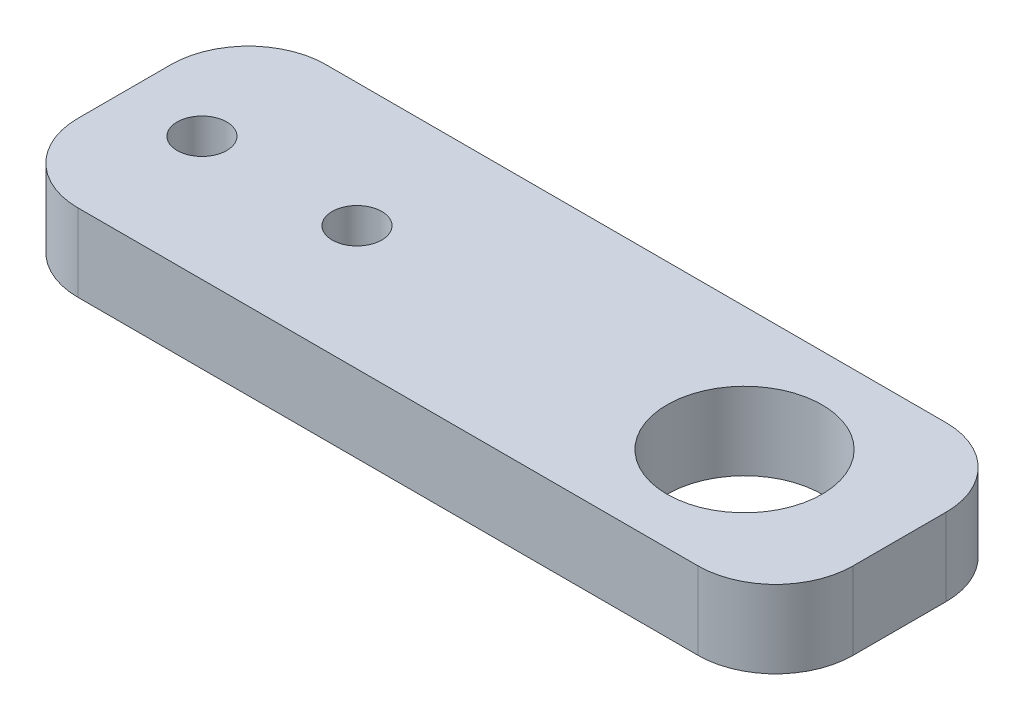
ISO-10303-21;
HEADER;
FILE_DESCRIPTION(('STEP AP214'),'2;1');
FILE_NAME('part.step','',(''),(''),'','','');
FILE_SCHEMA(('AUTOMOTIVE_DESIGN { 1 0 10303 214 1 1 1 1 }'));
ENDSEC;
DATA;
#1=APPLICATION_CONTEXT('core data for automotive mechanical design processes');
#2=APPLICATION_PROTOCOL_DEFINITION('international standard','automotive_design',2000,#1);
#3=PRODUCT_CONTEXT('',#1,'mechanical');
#4=PRODUCT('Part','Part','',(#3));
#5=PRODUCT_RELATED_PRODUCT_CATEGORY('part','',(#4));
#6=PRODUCT_DEFINITION_FORMATION('','',#4);
#7=PRODUCT_DEFINITION_CONTEXT('part definition',#1,'design');
#8=PRODUCT_DEFINITION('design','',#6,#7);
#9=PRODUCT_DEFINITION_SHAPE('','',#8);
#10=(LENGTH_UNIT() NAMED_UNIT(*) SI_UNIT(.MILLI.,.METRE.));
#11=(NAMED_UNIT(*) PLANE_ANGLE_UNIT() SI_UNIT($,.RADIAN.));
#12=(NAMED_UNIT(*) SI_UNIT($,.STERADIAN.) SOLID_ANGLE_UNIT());
#13=UNCERTAINTY_MEASURE_WITH_UNIT(LENGTH_MEASURE(1.E-05),#10,'distance_accuracy_value','');
#14=(GEOMETRIC_REPRESENTATION_CONTEXT(3) GLOBAL_UNCERTAINTY_ASSIGNED_CONTEXT((#13)) GLOBAL_UNIT_ASSIGNED_CONTEXT((#10,
#11,#12)) REPRESENTATION_CONTEXT('',''));
#15=CARTESIAN_POINT('',(0.,0.,0.));
#16=DIRECTION('',(0.,0.,1.));
#17=DIRECTION('',(1.,0.,0.));
#18=AXIS2_PLACEMENT_3D('',#15,#16,#17);
#19=CARTESIAN_POINT('',(0.,5.,0.));
#20=DIRECTION('',(0.,-1.,0.));
#21=DIRECTION('',(0.,0.,-1.));
#22=AXIS2_PLACEMENT_3D('',#19,#20,#21);
#23=PLANE('',#22);
#24=DIRECTION('',(1.,0.,0.));
#25=VECTOR('',#24,1.);
#26=CARTESIAN_POINT('',(0.,5.,0.));
#27=LINE('',#26,#25);
#28=CARTESIAN_POINT('',(5.,5.,0.));
#29=VERTEX_POINT('',#28);
#30=CARTESIAN_POINT('',(45.,5.,0.));
#31=VERTEX_POINT('',#30);
#32=EDGE_CURVE('E204',#29,#31,#27,.T.);
#33=ORIENTED_EDGE('',*,*,#32,.T.);
#34=CARTESIAN_POINT('',(45.,5.,-5.));
#35=DIRECTION('',(0.,-1.,0.));
#36=DIRECTION('',(0.,0.,-1.));
#37=AXIS2_PLACEMENT_3D('',#34,#35,#36);
#38=CIRCLE('',#37,5.);
#39=CARTESIAN_POINT('',(50.,5.,-5.));
#40=VERTEX_POINT('',#39);
#41=EDGE_CURVE('E173',#31,#40,#38,.F.);
#42=ORIENTED_EDGE('',*,*,#41,.T.);
#43=DIRECTION('',(0.,0.,-1.));
#44=VECTOR('',#43,1.);
#45=CARTESIAN_POINT('',(50.,5.,0.));
#46=LINE('',#45,#44);
#47=CARTESIAN_POINT('',(50.,5.,-11.));
#48=VERTEX_POINT('',#47);
#49=EDGE_CURVE('E130',#40,#48,#46,.T.);
#50=ORIENTED_EDGE('',*,*,#49,.T.);
#51=CARTESIAN_POINT('',(45.,5.,-11.));
#52=DIRECTION('',(0.,-1.,0.));
#53=DIRECTION('',(0.,0.,-1.));
#54=AXIS2_PLACEMENT_3D('',#51,#52,#53);
#55=CIRCLE('',#54,5.);
#56=CARTESIAN_POINT('',(45.,5.,-16.));
#57=VERTEX_POINT('',#56);
#58=EDGE_CURVE('E66',#48,#57,#55,.F.);
#59=ORIENTED_EDGE('',*,*,#58,.T.);
#60=DIRECTION('',(-1.,0.,0.));
#61=VECTOR('',#60,1.);
#62=CARTESIAN_POINT('',(0.,5.,-16.));
#63=LINE('',#62,#61);
#64=CARTESIAN_POINT('',(5.,5.,-16.));
#65=VERTEX_POINT('',#64);
#66=EDGE_CURVE('E151',#57,#65,#63,.T.);
#67=ORIENTED_EDGE('',*,*,#66,.T.);
#68=CARTESIAN_POINT('',(5.,5.,-11.));
#69=DIRECTION('',(0.,-1.,0.));
#70=DIRECTION('',(0.,0.,-1.));
#71=AXIS2_PLACEMENT_3D('',#68,#69,#70);
#72=CIRCLE('',#71,5.);
#73=CARTESIAN_POINT('',(0.,5.,-11.));
#74=VERTEX_POINT('',#73);
#75=EDGE_CURVE('E165',#65,#74,#72,.F.);
#76=ORIENTED_EDGE('',*,*,#75,.T.);
#77=DIRECTION('',(0.,0.,1.));
#78=VECTOR('',#77,1.);
#79=CARTESIAN_POINT('',(0.,5.,0.));
#80=LINE('',#79,#78);
#81=CARTESIAN_POINT('',(0.,5.,-5.));
#82=VERTEX_POINT('',#81);
#83=EDGE_CURVE('E144',#74,#82,#80,.T.);
#84=ORIENTED_EDGE('',*,*,#83,.T.);
#85=CARTESIAN_POINT('',(5.,5.,-5.));
#86=DIRECTION('',(0.,-1.,0.));
#87=DIRECTION('',(0.,0.,-1.));
#88=AXIS2_PLACEMENT_3D('',#85,#86,#87);
#89=CIRCLE('',#88,5.);
#90=EDGE_CURVE('E168',#82,#29,#89,.F.);
#91=ORIENTED_EDGE('',*,*,#90,.T.);
#92=EDGE_LOOP('',(#33,#42,#50,#59,#67,#76,#84,#91));
#93=FACE_BOUND('',#92,.T.);
#94=CARTESIAN_POINT('',(40.,5.,-8.));
#95=DIRECTION('',(0.,1.,0.));
#96=DIRECTION('',(0.,0.,1.));
#97=AXIS2_PLACEMENT_3D('',#94,#95,#96);
#98=CIRCLE('',#97,5.);
#99=CARTESIAN_POINT('',(40.,5.,-3.));
#100=VERTEX_POINT('',#99);
#101=EDGE_CURVE('E194',#100,#100,#98,.T.);
#102=ORIENTED_EDGE('',*,*,#101,.F.);
#103=EDGE_LOOP('',(#102));
#104=FACE_BOUND('',#103,.T.);
#105=CARTESIAN_POINT('',(5.,5.,-8.));
#106=DIRECTION('',(0.,1.,0.));
#107=DIRECTION('',(0.,0.,1.));
#108=AXIS2_PLACEMENT_3D('',#105,#106,#107);
#109=CIRCLE('',#108,1.6);
#110=CARTESIAN_POINT('',(5.,5.,-6.4));
#111=VERTEX_POINT('',#110);
#112=EDGE_CURVE('E212',#111,#111,#109,.T.);
#113=ORIENTED_EDGE('',*,*,#112,.F.);
#114=EDGE_LOOP('',(#113));
#115=FACE_BOUND('',#114,.T.);
#116=CARTESIAN_POINT('',(15.,5.,-8.));
#117=DIRECTION('',(0.,1.,0.));
#118=DIRECTION('',(0.,0.,1.));
#119=AXIS2_PLACEMENT_3D('',#116,#117,#118);
#120=CIRCLE('',#119,1.6);
#121=CARTESIAN_POINT('',(15.,5.,-6.4));
#122=VERTEX_POINT('',#121);
#123=EDGE_CURVE('E218',#122,#122,#120,.T.);
#124=ORIENTED_EDGE('',*,*,#123,.F.);
#125=EDGE_LOOP('',(#124));
#126=FACE_BOUND('',#125,.T.);
#127=ADVANCED_FACE('F43',(#93,#104,#115,#126),#23,.F.);
#128=CARTESIAN_POINT('',(0.,0.,0.));
#129=DIRECTION('',(0.,-1.,0.));
#130=DIRECTION('',(0.,0.,-1.));
#131=AXIS2_PLACEMENT_3D('',#128,#129,#130);
#132=PLANE('',#131);
#133=CARTESIAN_POINT('',(5.,0.,-8.));
#134=DIRECTION('',(0.,1.,0.));
#135=DIRECTION('',(0.,0.,1.));
#136=AXIS2_PLACEMENT_3D('',#133,#134,#135);
#137=CIRCLE('',#136,1.6);
#138=CARTESIAN_POINT('',(5.,0.,-6.4));
#139=VERTEX_POINT('',#138);
#140=EDGE_CURVE('E214',#139,#139,#137,.T.);
#141=ORIENTED_EDGE('',*,*,#140,.T.);
#142=EDGE_LOOP('',(#141));
#143=FACE_BOUND('',#142,.T.);
#144=DIRECTION('',(0.,0.,-1.));
#145=VECTOR('',#144,1.);
#146=CARTESIAN_POINT('',(50.,0.,0.));
#147=LINE('',#146,#145);
#148=CARTESIAN_POINT('',(50.,0.,-5.));
#149=VERTEX_POINT('',#148);
#150=CARTESIAN_POINT('',(50.,0.,-11.));
#151=VERTEX_POINT('',#150);
#152=EDGE_CURVE('E128',#149,#151,#147,.T.);
#153=ORIENTED_EDGE('',*,*,#152,.F.);
#154=CARTESIAN_POINT('',(45.,0.,-5.));
#155=DIRECTION('',(0.,-1.,0.));
#156=DIRECTION('',(0.,0.,-1.));
#157=AXIS2_PLACEMENT_3D('',#154,#155,#156);
#158=CIRCLE('',#157,5.);
#159=CARTESIAN_POINT('',(45.,0.,0.));
#160=VERTEX_POINT('',#159);
#161=EDGE_CURVE('E110',#149,#160,#158,.T.);
#162=ORIENTED_EDGE('',*,*,#161,.T.);
#163=DIRECTION('',(1.,0.,0.));
#164=VECTOR('',#163,1.);
#165=CARTESIAN_POINT('',(0.,0.,0.));
#166=LINE('',#165,#164);
#167=CARTESIAN_POINT('',(5.,0.,0.));
#168=VERTEX_POINT('',#167);
#169=EDGE_CURVE('E140',#168,#160,#166,.T.);
#170=ORIENTED_EDGE('',*,*,#169,.F.);
#171=CARTESIAN_POINT('',(5.,0.,-5.));
#172=DIRECTION('',(0.,-1.,0.));
#173=DIRECTION('',(0.,0.,-1.));
#174=AXIS2_PLACEMENT_3D('',#171,#172,#173);
#175=CIRCLE('',#174,5.);
#176=CARTESIAN_POINT('',(0.,0.,-5.));
#177=VERTEX_POINT('',#176);
#178=EDGE_CURVE('E155',#168,#177,#175,.T.);
#179=ORIENTED_EDGE('',*,*,#178,.T.);
#180=DIRECTION('',(0.,0.,1.));
#181=VECTOR('',#180,1.);
#182=CARTESIAN_POINT('',(0.,0.,0.));
#183=LINE('',#182,#181);
#184=CARTESIAN_POINT('',(0.,0.,-11.));
#185=VERTEX_POINT('',#184);
#186=EDGE_CURVE('E146',#185,#177,#183,.T.);
#187=ORIENTED_EDGE('',*,*,#186,.F.);
#188=CARTESIAN_POINT('',(5.,0.,-11.));
#189=DIRECTION('',(0.,-1.,0.));
#190=DIRECTION('',(0.,0.,-1.));
#191=AXIS2_PLACEMENT_3D('',#188,#189,#190);
#192=CIRCLE('',#191,5.);
#193=CARTESIAN_POINT('',(5.,0.,-16.));
#194=VERTEX_POINT('',#193);
#195=EDGE_CURVE('E132',#185,#194,#192,.T.);
#196=ORIENTED_EDGE('',*,*,#195,.T.);
#197=DIRECTION('',(-1.,0.,0.));
#198=VECTOR('',#197,1.);
#199=CARTESIAN_POINT('',(0.,0.,-16.));
#200=LINE('',#199,#198);
#201=CARTESIAN_POINT('',(45.,0.,-16.));
#202=VERTEX_POINT('',#201);
#203=EDGE_CURVE('E139',#202,#194,#200,.T.);
#204=ORIENTED_EDGE('',*,*,#203,.F.);
#205=CARTESIAN_POINT('',(45.,0.,-11.));
#206=DIRECTION('',(0.,-1.,0.));
#207=DIRECTION('',(0.,0.,-1.));
#208=AXIS2_PLACEMENT_3D('',#205,#206,#207);
#209=CIRCLE('',#208,5.);
#210=EDGE_CURVE('E122',#202,#151,#209,.T.);
#211=ORIENTED_EDGE('',*,*,#210,.T.);
#212=EDGE_LOOP('',(#153,#162,#170,#179,#187,#196,#204,#211));
#213=FACE_BOUND('',#212,.T.);
#214=CARTESIAN_POINT('',(40.,0.,-8.));
#215=DIRECTION('',(0.,1.,0.));
#216=DIRECTION('',(0.,0.,1.));
#217=AXIS2_PLACEMENT_3D('',#214,#215,#216);
#218=CIRCLE('',#217,5.);
#219=CARTESIAN_POINT('',(40.,0.,-3.));
#220=VERTEX_POINT('',#219);
#221=EDGE_CURVE('E197',#220,#220,#218,.T.);
#222=ORIENTED_EDGE('',*,*,#221,.T.);
#223=EDGE_LOOP('',(#222));
#224=FACE_BOUND('',#223,.T.);
#225=CARTESIAN_POINT('',(15.,0.,-8.));
#226=DIRECTION('',(0.,1.,0.));
#227=DIRECTION('',(0.,0.,1.));
#228=AXIS2_PLACEMENT_3D('',#225,#226,#227);
#229=CIRCLE('',#228,1.6);
#230=CARTESIAN_POINT('',(15.,0.,-6.4));
#231=VERTEX_POINT('',#230);
#232=EDGE_CURVE('E222',#231,#231,#229,.T.);
#233=ORIENTED_EDGE('',*,*,#232,.T.);
#234=EDGE_LOOP('',(#233));
#235=FACE_BOUND('',#234,.T.);
#236=ADVANCED_FACE('F135',(#143,#213,#224,#235),#132,.T.);
#237=CARTESIAN_POINT('',(0.,5.,0.));
#238=DIRECTION('',(1.,0.,0.));
#239=DIRECTION('',(0.,0.,-1.));
#240=AXIS2_PLACEMENT_3D('',#237,#238,#239);
#241=PLANE('',#240);
#242=ORIENTED_EDGE('',*,*,#186,.T.);
#243=DIRECTION('',(0.,-1.,0.));
#244=VECTOR('',#243,1.);
#245=CARTESIAN_POINT('',(0.,5.,-5.));
#246=LINE('',#245,#244);
#247=EDGE_CURVE('E11',#177,#82,#246,.F.);
#248=ORIENTED_EDGE('',*,*,#247,.T.);
#249=ORIENTED_EDGE('',*,*,#83,.F.);
#250=DIRECTION('',(0.,-1.,0.));
#251=VECTOR('',#250,1.);
#252=CARTESIAN_POINT('',(0.,5.,-11.));
#253=LINE('',#252,#251);
#254=EDGE_CURVE('E52',#74,#185,#253,.T.);
#255=ORIENTED_EDGE('',*,*,#254,.T.);
#256=EDGE_LOOP('',(#242,#248,#249,#255));
#257=FACE_BOUND('',#256,.T.);
#258=ADVANCED_FACE('F188',(#257),#241,.F.);
#259=CARTESIAN_POINT('',(0.,5.,0.));
#260=DIRECTION('',(0.,0.,-1.));
#261=DIRECTION('',(-1.,0.,0.));
#262=AXIS2_PLACEMENT_3D('',#259,#260,#261);
#263=PLANE('',#262);
#264=ORIENTED_EDGE('',*,*,#169,.T.);
#265=DIRECTION('',(0.,-1.,0.));
#266=VECTOR('',#265,1.);
#267=CARTESIAN_POINT('',(45.,5.,0.));
#268=LINE('',#267,#266);
#269=EDGE_CURVE('E115',#160,#31,#268,.F.);
#270=ORIENTED_EDGE('',*,*,#269,.T.);
#271=ORIENTED_EDGE('',*,*,#32,.F.);
#272=DIRECTION('',(0.,-1.,0.));
#273=VECTOR('',#272,1.);
#274=CARTESIAN_POINT('',(5.,5.,0.));
#275=LINE('',#274,#273);
#276=EDGE_CURVE('E121',#29,#168,#275,.T.);
#277=ORIENTED_EDGE('',*,*,#276,.T.);
#278=EDGE_LOOP('',(#264,#270,#271,#277));
#279=FACE_BOUND('',#278,.T.);
#280=ADVANCED_FACE('F250',(#279),#263,.F.);
#281=CARTESIAN_POINT('',(50.,5.,0.));
#282=DIRECTION('',(-1.,0.,0.));
#283=DIRECTION('',(0.,0.,1.));
#284=AXIS2_PLACEMENT_3D('',#281,#282,#283);
#285=PLANE('',#284);
#286=ORIENTED_EDGE('',*,*,#49,.F.);
#287=DIRECTION('',(0.,-1.,0.));
#288=VECTOR('',#287,1.);
#289=CARTESIAN_POINT('',(50.,5.,-5.));
#290=LINE('',#289,#288);
#291=EDGE_CURVE('E114',#40,#149,#290,.T.);
#292=ORIENTED_EDGE('',*,*,#291,.T.);
#293=ORIENTED_EDGE('',*,*,#152,.T.);
#294=DIRECTION('',(0.,-1.,0.));
#295=VECTOR('',#294,1.);
#296=CARTESIAN_POINT('',(50.,5.,-11.));
#297=LINE('',#296,#295);
#298=EDGE_CURVE('E133',#151,#48,#297,.F.);
#299=ORIENTED_EDGE('',*,*,#298,.T.);
#300=EDGE_LOOP('',(#286,#292,#293,#299));
#301=FACE_BOUND('',#300,.T.);
#302=ADVANCED_FACE('F127',(#301),#285,.F.);
#303=CARTESIAN_POINT('',(0.,5.,-16.));
#304=DIRECTION('',(0.,0.,1.));
#305=DIRECTION('',(1.,0.,0.));
#306=AXIS2_PLACEMENT_3D('',#303,#304,#305);
#307=PLANE('',#306);
#308=ORIENTED_EDGE('',*,*,#66,.F.);
#309=DIRECTION('',(0.,-1.,0.));
#310=VECTOR('',#309,1.);
#311=CARTESIAN_POINT('',(45.,5.,-16.));
#312=LINE('',#311,#310);
#313=EDGE_CURVE('E178',#57,#202,#312,.T.);
#314=ORIENTED_EDGE('',*,*,#313,.T.);
#315=ORIENTED_EDGE('',*,*,#203,.T.);
#316=DIRECTION('',(0.,-1.,0.));
#317=VECTOR('',#316,1.);
#318=CARTESIAN_POINT('',(5.,5.,-16.));
#319=LINE('',#318,#317);
#320=EDGE_CURVE('E59',#194,#65,#319,.F.);
#321=ORIENTED_EDGE('',*,*,#320,.T.);
#322=EDGE_LOOP('',(#308,#314,#315,#321));
#323=FACE_BOUND('',#322,.T.);
#324=ADVANCED_FACE('F245',(#323),#307,.F.);
#325=CARTESIAN_POINT('',(40.,5.,-8.));
#326=DIRECTION('',(0.,-1.,0.));
#327=DIRECTION('',(0.,0.,-1.));
#328=AXIS2_PLACEMENT_3D('',#325,#326,#327);
#329=CYLINDRICAL_SURFACE('',#328,5.);
#330=ORIENTED_EDGE('',*,*,#101,.T.);
#331=EDGE_LOOP('',(#330));
#332=FACE_BOUND('',#331,.T.);
#333=ORIENTED_EDGE('',*,*,#221,.F.);
#334=EDGE_LOOP('',(#333));
#335=FACE_BOUND('',#334,.T.);
#336=ADVANCED_FACE('F242',(#332,#335),#329,.F.);
#337=CARTESIAN_POINT('',(5.,5.,-8.));
#338=DIRECTION('',(0.,-1.,0.));
#339=DIRECTION('',(0.,0.,-1.));
#340=AXIS2_PLACEMENT_3D('',#337,#338,#339);
#341=CYLINDRICAL_SURFACE('',#340,1.6);
#342=ORIENTED_EDGE('',*,*,#112,.T.);
#343=EDGE_LOOP('',(#342));
#344=FACE_BOUND('',#343,.T.);
#345=ORIENTED_EDGE('',*,*,#140,.F.);
#346=EDGE_LOOP('',(#345));
#347=FACE_BOUND('',#346,.T.);
#348=ADVANCED_FACE('F344',(#344,#347),#341,.F.);
#349=CARTESIAN_POINT('',(15.,5.,-8.));
#350=DIRECTION('',(0.,-1.,0.));
#351=DIRECTION('',(0.,0.,-1.));
#352=AXIS2_PLACEMENT_3D('',#349,#350,#351);
#353=CYLINDRICAL_SURFACE('',#352,1.6);
#354=ORIENTED_EDGE('',*,*,#123,.T.);
#355=EDGE_LOOP('',(#354));
#356=FACE_BOUND('',#355,.T.);
#357=ORIENTED_EDGE('',*,*,#232,.F.);
#358=EDGE_LOOP('',(#357));
#359=FACE_BOUND('',#358,.T.);
#360=ADVANCED_FACE('F230',(#356,#359),#353,.F.);
#361=CARTESIAN_POINT('',(45.,5.,-5.));
#362=DIRECTION('',(0.,-1.,0.));
#363=DIRECTION('',(0.,0.,-1.));
#364=AXIS2_PLACEMENT_3D('',#361,#362,#363);
#365=CYLINDRICAL_SURFACE('',#364,5.);
#366=ORIENTED_EDGE('',*,*,#41,.F.);
#367=ORIENTED_EDGE('',*,*,#269,.F.);
#368=ORIENTED_EDGE('',*,*,#161,.F.);
#369=ORIENTED_EDGE('',*,*,#291,.F.);
#370=EDGE_LOOP('',(#366,#367,#368,#369));
#371=FACE_BOUND('',#370,.T.);
#372=ADVANCED_FACE('F113',(#371),#365,.T.);
#373=CARTESIAN_POINT('',(45.,5.,-11.));
#374=DIRECTION('',(0.,-1.,0.));
#375=DIRECTION('',(0.,0.,-1.));
#376=AXIS2_PLACEMENT_3D('',#373,#374,#375);
#377=CYLINDRICAL_SURFACE('',#376,5.);
#378=ORIENTED_EDGE('',*,*,#58,.F.);
#379=ORIENTED_EDGE('',*,*,#298,.F.);
#380=ORIENTED_EDGE('',*,*,#210,.F.);
#381=ORIENTED_EDGE('',*,*,#313,.F.);
#382=EDGE_LOOP('',(#378,#379,#380,#381));
#383=FACE_BOUND('',#382,.T.);
#384=ADVANCED_FACE('F258',(#383),#377,.T.);
#385=CARTESIAN_POINT('',(5.,5.,-5.));
#386=DIRECTION('',(0.,-1.,0.));
#387=DIRECTION('',(0.,0.,-1.));
#388=AXIS2_PLACEMENT_3D('',#385,#386,#387);
#389=CYLINDRICAL_SURFACE('',#388,5.);
#390=ORIENTED_EDGE('',*,*,#90,.F.);
#391=ORIENTED_EDGE('',*,*,#247,.F.);
#392=ORIENTED_EDGE('',*,*,#178,.F.);
#393=ORIENTED_EDGE('',*,*,#276,.F.);
#394=EDGE_LOOP('',(#390,#391,#392,#393));
#395=FACE_BOUND('',#394,.T.);
#396=ADVANCED_FACE('F260',(#395),#389,.T.);
#397=CARTESIAN_POINT('',(5.,5.,-11.));
#398=DIRECTION('',(0.,-1.,0.));
#399=DIRECTION('',(0.,0.,-1.));
#400=AXIS2_PLACEMENT_3D('',#397,#398,#399);
#401=CYLINDRICAL_SURFACE('',#400,5.);
#402=ORIENTED_EDGE('',*,*,#75,.F.);
#403=ORIENTED_EDGE('',*,*,#320,.F.);
#404=ORIENTED_EDGE('',*,*,#195,.F.);
#405=ORIENTED_EDGE('',*,*,#254,.F.);
#406=EDGE_LOOP('',(#402,#403,#404,#405));
#407=FACE_BOUND('',#406,.T.);
#408=ADVANCED_FACE('F45',(#407),#401,.T.);
#409=CLOSED_SHELL('',(#127,#236,#258,#280,#302,#324,#336,#348,#360,#372,#384,#396,#408));
#410=MANIFOLD_SOLID_BREP('B2',#409);
#411=ADVANCED_BREP_SHAPE_REPRESENTATION('',(#18,#410),#14);
#412=SHAPE_DEFINITION_REPRESENTATION(#9,#411);
ENDSEC;
END-ISO-10303-21;
